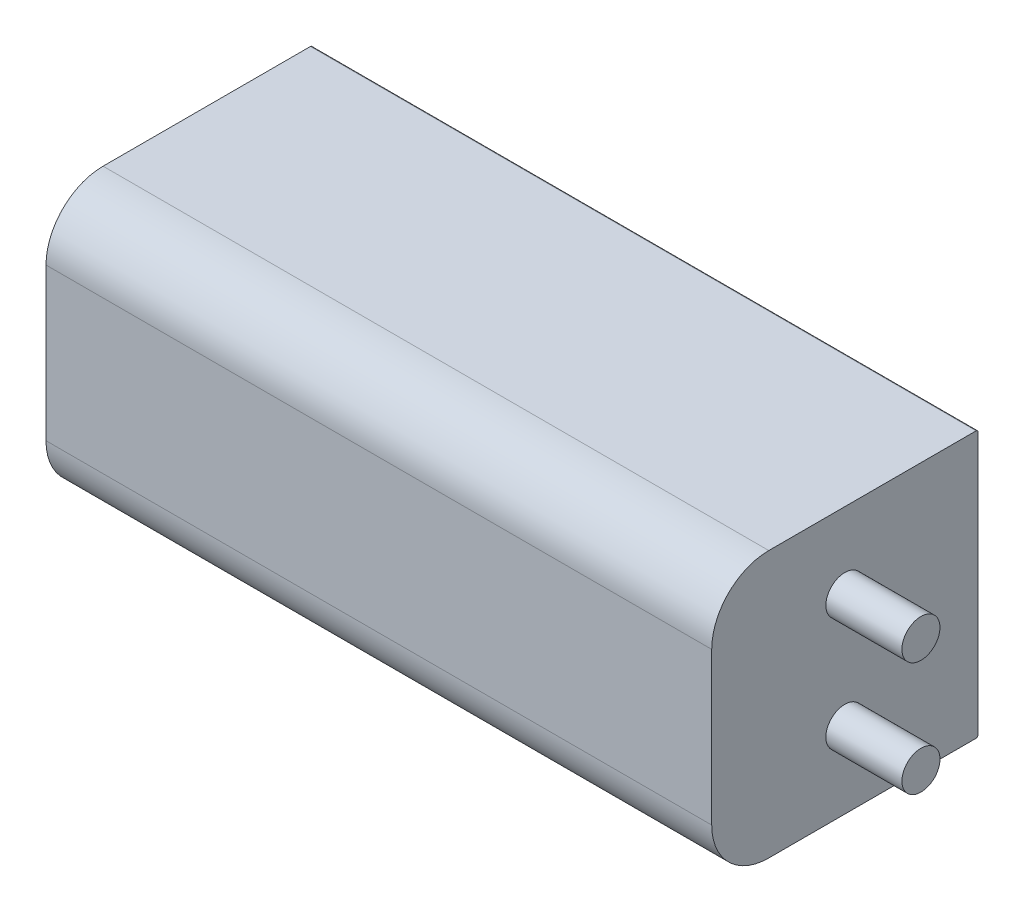
ISO-10303-21;
HEADER;
FILE_DESCRIPTION(('STEP AP214'),'2;1');
FILE_NAME('part.step','',(''),(''),'','','');
FILE_SCHEMA(('AUTOMOTIVE_DESIGN { 1 0 10303 214 1 1 1 1 }'));
ENDSEC;
DATA;
#1=APPLICATION_CONTEXT('core data for automotive mechanical design processes');
#2=APPLICATION_PROTOCOL_DEFINITION('international standard','automotive_design',2000,#1);
#3=PRODUCT_CONTEXT('',#1,'mechanical');
#4=PRODUCT('Part','Part','',(#3));
#5=PRODUCT_RELATED_PRODUCT_CATEGORY('part','',(#4));
#6=PRODUCT_DEFINITION_FORMATION('','',#4);
#7=PRODUCT_DEFINITION_CONTEXT('part definition',#1,'design');
#8=PRODUCT_DEFINITION('design','',#6,#7);
#9=PRODUCT_DEFINITION_SHAPE('','',#8);
#10=(LENGTH_UNIT() NAMED_UNIT(*) SI_UNIT(.MILLI.,.METRE.));
#11=(NAMED_UNIT(*) PLANE_ANGLE_UNIT() SI_UNIT($,.RADIAN.));
#12=(NAMED_UNIT(*) SI_UNIT($,.STERADIAN.) SOLID_ANGLE_UNIT());
#13=UNCERTAINTY_MEASURE_WITH_UNIT(LENGTH_MEASURE(1.E-05),#10,'distance_accuracy_value','');
#14=(GEOMETRIC_REPRESENTATION_CONTEXT(3) GLOBAL_UNCERTAINTY_ASSIGNED_CONTEXT((#13)) GLOBAL_UNIT_ASSIGNED_CONTEXT((#10,
#11,#12)) REPRESENTATION_CONTEXT('',''));
#15=CARTESIAN_POINT('',(0.,0.,0.));
#16=DIRECTION('',(0.,0.,1.));
#17=DIRECTION('',(1.,0.,0.));
#18=AXIS2_PLACEMENT_3D('',#15,#16,#17);
#19=CARTESIAN_POINT('',(0.,140.,0.));
#20=DIRECTION('',(0.,0.,-1.));
#21=DIRECTION('',(-1.,0.,0.));
#22=AXIS2_PLACEMENT_3D('',#19,#20,#21);
#23=PLANE('',#22);
#24=DIRECTION('',(0.,-1.,0.));
#25=VECTOR('',#24,1.);
#26=CARTESIAN_POINT('',(0.,140.,0.));
#27=LINE('',#26,#25);
#28=CARTESIAN_POINT('',(0.,139.,0.));
#29=VERTEX_POINT('',#28);
#30=CARTESIAN_POINT('',(0.,1.,0.));
#31=VERTEX_POINT('',#30);
#32=EDGE_CURVE('E124',#29,#31,#27,.T.);
#33=ORIENTED_EDGE('',*,*,#32,.F.);
#34=DIRECTION('',(1.,0.,0.));
#35=VECTOR('',#34,1.);
#36=CARTESIAN_POINT('',(0.,139.,0.));
#37=LINE('',#36,#35);
#38=CARTESIAN_POINT('',(350.,139.,0.));
#39=VERTEX_POINT('',#38);
#40=EDGE_CURVE('E142',#29,#39,#37,.T.);
#41=ORIENTED_EDGE('',*,*,#40,.T.);
#42=DIRECTION('',(0.,-1.,0.));
#43=VECTOR('',#42,1.);
#44=CARTESIAN_POINT('',(350.,140.,0.));
#45=LINE('',#44,#43);
#46=CARTESIAN_POINT('',(350.,1.,0.));
#47=VERTEX_POINT('',#46);
#48=EDGE_CURVE('E160',#39,#47,#45,.T.);
#49=ORIENTED_EDGE('',*,*,#48,.T.);
#50=DIRECTION('',(1.,0.,0.));
#51=VECTOR('',#50,1.);
#52=CARTESIAN_POINT('',(0.,1.,0.));
#53=LINE('',#52,#51);
#54=EDGE_CURVE('E140',#47,#31,#53,.F.);
#55=ORIENTED_EDGE('',*,*,#54,.T.);
#56=EDGE_LOOP('',(#33,#41,#49,#55));
#57=FACE_BOUND('',#56,.T.);
#58=ADVANCED_FACE('F35',(#57),#23,.T.);
#59=CARTESIAN_POINT('',(0.,140.,0.));
#60=DIRECTION('',(1.,0.,0.));
#61=DIRECTION('',(0.,0.,-1.));
#62=AXIS2_PLACEMENT_3D('',#59,#60,#61);
#63=PLANE('',#62);
#64=CARTESIAN_POINT('',(0.,40.,70.));
#65=DIRECTION('',(1.,0.,0.));
#66=DIRECTION('',(0.,0.,-1.));
#67=AXIS2_PLACEMENT_3D('',#64,#65,#66);
#68=CIRCLE('',#67,10.5);
#69=CARTESIAN_POINT('',(0.,40.,59.5));
#70=VERTEX_POINT('',#69);
#71=EDGE_CURVE('E361',#70,#70,#68,.T.);
#72=ORIENTED_EDGE('',*,*,#71,.T.);
#73=EDGE_LOOP('',(#72));
#74=FACE_BOUND('',#73,.T.);
#75=CARTESIAN_POINT('',(0.,100.,70.));
#76=DIRECTION('',(1.,0.,0.));
#77=DIRECTION('',(0.,0.,-1.));
#78=AXIS2_PLACEMENT_3D('',#75,#76,#77);
#79=CIRCLE('',#78,10.5);
#80=CARTESIAN_POINT('',(0.,100.,59.5));
#81=VERTEX_POINT('',#80);
#82=EDGE_CURVE('E356',#81,#81,#79,.T.);
#83=ORIENTED_EDGE('',*,*,#82,.T.);
#84=EDGE_LOOP('',(#83));
#85=FACE_BOUND('',#84,.T.);
#86=DIRECTION('',(0.,0.,1.));
#87=VECTOR('',#86,1.);
#88=CARTESIAN_POINT('',(0.,140.,0.));
#89=LINE('',#88,#87);
#90=CARTESIAN_POINT('',(0.,140.,1.));
#91=VERTEX_POINT('',#90);
#92=CARTESIAN_POINT('',(0.,140.,110.));
#93=VERTEX_POINT('',#92);
#94=EDGE_CURVE('E100',#91,#93,#89,.T.);
#95=ORIENTED_EDGE('',*,*,#94,.F.);
#96=CARTESIAN_POINT('',(0.,139.,1.));
#97=DIRECTION('',(1.,0.,0.));
#98=DIRECTION('',(0.,0.,-1.));
#99=AXIS2_PLACEMENT_3D('',#96,#97,#98);
#100=CIRCLE('',#99,1.);
#101=EDGE_CURVE('E43',#91,#29,#100,.F.);
#102=ORIENTED_EDGE('',*,*,#101,.T.);
#103=ORIENTED_EDGE('',*,*,#32,.T.);
#104=CARTESIAN_POINT('',(0.,1.,1.));
#105=DIRECTION('',(1.,0.,0.));
#106=DIRECTION('',(0.,0.,-1.));
#107=AXIS2_PLACEMENT_3D('',#104,#105,#106);
#108=CIRCLE('',#107,1.);
#109=CARTESIAN_POINT('',(0.,0.,1.));
#110=VERTEX_POINT('',#109);
#111=EDGE_CURVE('E50',#31,#110,#108,.F.);
#112=ORIENTED_EDGE('',*,*,#111,.T.);
#113=DIRECTION('',(0.,0.,1.));
#114=VECTOR('',#113,1.);
#115=CARTESIAN_POINT('',(0.,0.,0.));
#116=LINE('',#115,#114);
#117=CARTESIAN_POINT('',(0.,0.,110.));
#118=VERTEX_POINT('',#117);
#119=EDGE_CURVE('E166',#110,#118,#116,.T.);
#120=ORIENTED_EDGE('',*,*,#119,.T.);
#121=CARTESIAN_POINT('',(0.,30.,110.));
#122=DIRECTION('',(1.,0.,0.));
#123=DIRECTION('',(0.,0.,-1.));
#124=AXIS2_PLACEMENT_3D('',#121,#122,#123);
#125=CIRCLE('',#124,30.);
#126=CARTESIAN_POINT('',(0.,30.,140.));
#127=VERTEX_POINT('',#126);
#128=EDGE_CURVE('E118',#118,#127,#125,.F.);
#129=ORIENTED_EDGE('',*,*,#128,.T.);
#130=DIRECTION('',(0.,-1.,0.));
#131=VECTOR('',#130,1.);
#132=CARTESIAN_POINT('',(0.,140.,140.));
#133=LINE('',#132,#131);
#134=CARTESIAN_POINT('',(0.,110.,140.));
#135=VERTEX_POINT('',#134);
#136=EDGE_CURVE('E114',#135,#127,#133,.T.);
#137=ORIENTED_EDGE('',*,*,#136,.F.);
#138=CARTESIAN_POINT('',(0.,110.,110.));
#139=DIRECTION('',(1.,0.,0.));
#140=DIRECTION('',(0.,0.,-1.));
#141=AXIS2_PLACEMENT_3D('',#138,#139,#140);
#142=CIRCLE('',#141,30.);
#143=EDGE_CURVE('E111',#135,#93,#142,.F.);
#144=ORIENTED_EDGE('',*,*,#143,.T.);
#145=EDGE_LOOP('',(#95,#102,#103,#112,#120,#129,#137,#144));
#146=FACE_BOUND('',#145,.T.);
#147=ADVANCED_FACE('F112',(#74,#85,#146),#63,.F.);
#148=CARTESIAN_POINT('',(0.,140.,140.));
#149=DIRECTION('',(0.,0.,-1.));
#150=DIRECTION('',(-1.,0.,0.));
#151=AXIS2_PLACEMENT_3D('',#148,#149,#150);
#152=PLANE('',#151);
#153=DIRECTION('',(0.,-1.,0.));
#154=VECTOR('',#153,1.);
#155=CARTESIAN_POINT('',(350.,140.,140.));
#156=LINE('',#155,#154);
#157=CARTESIAN_POINT('',(350.,110.,140.));
#158=VERTEX_POINT('',#157);
#159=CARTESIAN_POINT('',(350.,30.,140.));
#160=VERTEX_POINT('',#159);
#161=EDGE_CURVE('E162',#158,#160,#156,.T.);
#162=ORIENTED_EDGE('',*,*,#161,.F.);
#163=DIRECTION('',(1.,0.,0.));
#164=VECTOR('',#163,1.);
#165=CARTESIAN_POINT('',(0.,110.,140.));
#166=LINE('',#165,#164);
#167=EDGE_CURVE('E135',#158,#135,#166,.F.);
#168=ORIENTED_EDGE('',*,*,#167,.T.);
#169=ORIENTED_EDGE('',*,*,#136,.T.);
#170=DIRECTION('',(1.,0.,0.));
#171=VECTOR('',#170,1.);
#172=CARTESIAN_POINT('',(0.,30.,140.));
#173=LINE('',#172,#171);
#174=EDGE_CURVE('E132',#127,#160,#173,.T.);
#175=ORIENTED_EDGE('',*,*,#174,.T.);
#176=EDGE_LOOP('',(#162,#168,#169,#175));
#177=FACE_BOUND('',#176,.T.);
#178=ADVANCED_FACE('F174',(#177),#152,.F.);
#179=CARTESIAN_POINT('',(350.,140.,0.));
#180=DIRECTION('',(1.,0.,0.));
#181=DIRECTION('',(0.,0.,-1.));
#182=AXIS2_PLACEMENT_3D('',#179,#180,#181);
#183=PLANE('',#182);
#184=CARTESIAN_POINT('',(350.,40.,70.));
#185=DIRECTION('',(1.,0.,0.));
#186=DIRECTION('',(0.,0.,-1.));
#187=AXIS2_PLACEMENT_3D('',#184,#185,#186);
#188=CIRCLE('',#187,10.);
#189=CARTESIAN_POINT('',(350.,40.,60.));
#190=VERTEX_POINT('',#189);
#191=EDGE_CURVE('E373',#190,#190,#188,.T.);
#192=ORIENTED_EDGE('',*,*,#191,.F.);
#193=EDGE_LOOP('',(#192));
#194=FACE_BOUND('',#193,.T.);
#195=CARTESIAN_POINT('',(350.,100.,70.));
#196=DIRECTION('',(1.,0.,0.));
#197=DIRECTION('',(0.,0.,-1.));
#198=AXIS2_PLACEMENT_3D('',#195,#196,#197);
#199=CIRCLE('',#198,10.);
#200=CARTESIAN_POINT('',(350.,100.,60.));
#201=VERTEX_POINT('',#200);
#202=EDGE_CURVE('E367',#201,#201,#199,.T.);
#203=ORIENTED_EDGE('',*,*,#202,.F.);
#204=EDGE_LOOP('',(#203));
#205=FACE_BOUND('',#204,.T.);
#206=ORIENTED_EDGE('',*,*,#48,.F.);
#207=CARTESIAN_POINT('',(350.,139.,1.));
#208=DIRECTION('',(1.,0.,0.));
#209=DIRECTION('',(0.,0.,-1.));
#210=AXIS2_PLACEMENT_3D('',#207,#208,#209);
#211=CIRCLE('',#210,1.);
#212=CARTESIAN_POINT('',(350.,140.,1.));
#213=VERTEX_POINT('',#212);
#214=EDGE_CURVE('E147',#39,#213,#211,.T.);
#215=ORIENTED_EDGE('',*,*,#214,.T.);
#216=DIRECTION('',(0.,0.,1.));
#217=VECTOR('',#216,1.);
#218=CARTESIAN_POINT('',(350.,140.,0.));
#219=LINE('',#218,#217);
#220=CARTESIAN_POINT('',(350.,140.,110.));
#221=VERTEX_POINT('',#220);
#222=EDGE_CURVE('E106',#213,#221,#219,.T.);
#223=ORIENTED_EDGE('',*,*,#222,.T.);
#224=CARTESIAN_POINT('',(350.,110.,110.));
#225=DIRECTION('',(1.,0.,0.));
#226=DIRECTION('',(0.,0.,-1.));
#227=AXIS2_PLACEMENT_3D('',#224,#225,#226);
#228=CIRCLE('',#227,30.);
#229=EDGE_CURVE('E122',#221,#158,#228,.T.);
#230=ORIENTED_EDGE('',*,*,#229,.T.);
#231=ORIENTED_EDGE('',*,*,#161,.T.);
#232=CARTESIAN_POINT('',(350.,30.,110.));
#233=DIRECTION('',(1.,0.,0.));
#234=DIRECTION('',(0.,0.,-1.));
#235=AXIS2_PLACEMENT_3D('',#232,#233,#234);
#236=CIRCLE('',#235,30.);
#237=CARTESIAN_POINT('',(350.,0.,110.));
#238=VERTEX_POINT('',#237);
#239=EDGE_CURVE('E123',#160,#238,#236,.T.);
#240=ORIENTED_EDGE('',*,*,#239,.T.);
#241=DIRECTION('',(0.,0.,1.));
#242=VECTOR('',#241,1.);
#243=CARTESIAN_POINT('',(350.,0.,0.));
#244=LINE('',#243,#242);
#245=CARTESIAN_POINT('',(350.,0.,1.));
#246=VERTEX_POINT('',#245);
#247=EDGE_CURVE('E107',#246,#238,#244,.T.);
#248=ORIENTED_EDGE('',*,*,#247,.F.);
#249=CARTESIAN_POINT('',(350.,1.,1.));
#250=DIRECTION('',(1.,0.,0.));
#251=DIRECTION('',(0.,0.,-1.));
#252=AXIS2_PLACEMENT_3D('',#249,#250,#251);
#253=CIRCLE('',#252,1.);
#254=EDGE_CURVE('E145',#246,#47,#253,.T.);
#255=ORIENTED_EDGE('',*,*,#254,.T.);
#256=EDGE_LOOP('',(#206,#215,#223,#230,#231,#240,#248,#255));
#257=FACE_BOUND('',#256,.T.);
#258=ADVANCED_FACE('F159',(#194,#205,#257),#183,.T.);
#259=CARTESIAN_POINT('',(0.,140.,0.));
#260=DIRECTION('',(0.,1.,0.));
#261=DIRECTION('',(0.,0.,1.));
#262=AXIS2_PLACEMENT_3D('',#259,#260,#261);
#263=PLANE('',#262);
#264=ORIENTED_EDGE('',*,*,#222,.F.);
#265=DIRECTION('',(1.,0.,0.));
#266=VECTOR('',#265,1.);
#267=CARTESIAN_POINT('',(0.,140.,1.));
#268=LINE('',#267,#266);
#269=EDGE_CURVE('E58',#213,#91,#268,.F.);
#270=ORIENTED_EDGE('',*,*,#269,.T.);
#271=ORIENTED_EDGE('',*,*,#94,.T.);
#272=DIRECTION('',(1.,0.,0.));
#273=VECTOR('',#272,1.);
#274=CARTESIAN_POINT('',(350.,140.,110.));
#275=LINE('',#274,#273);
#276=EDGE_CURVE('E104',#93,#221,#275,.T.);
#277=ORIENTED_EDGE('',*,*,#276,.T.);
#278=EDGE_LOOP('',(#264,#270,#271,#277));
#279=FACE_BOUND('',#278,.T.);
#280=ADVANCED_FACE('F102',(#279),#263,.T.);
#281=CARTESIAN_POINT('',(0.,0.,0.));
#282=DIRECTION('',(0.,1.,0.));
#283=DIRECTION('',(0.,0.,1.));
#284=AXIS2_PLACEMENT_3D('',#281,#282,#283);
#285=PLANE('',#284);
#286=ORIENTED_EDGE('',*,*,#119,.F.);
#287=DIRECTION('',(1.,0.,0.));
#288=VECTOR('',#287,1.);
#289=CARTESIAN_POINT('',(350.,0.,1.));
#290=LINE('',#289,#288);
#291=EDGE_CURVE('E11',#110,#246,#290,.T.);
#292=ORIENTED_EDGE('',*,*,#291,.T.);
#293=ORIENTED_EDGE('',*,*,#247,.T.);
#294=DIRECTION('',(1.,0.,0.));
#295=VECTOR('',#294,1.);
#296=CARTESIAN_POINT('',(0.,0.,110.));
#297=LINE('',#296,#295);
#298=EDGE_CURVE('E117',#238,#118,#297,.F.);
#299=ORIENTED_EDGE('',*,*,#298,.T.);
#300=EDGE_LOOP('',(#286,#292,#293,#299));
#301=FACE_BOUND('',#300,.T.);
#302=ADVANCED_FACE('F181',(#301),#285,.F.);
#303=CARTESIAN_POINT('',(41.,100.,70.));
#304=DIRECTION('',(-1.,0.,0.));
#305=DIRECTION('',(0.,0.,1.));
#306=AXIS2_PLACEMENT_3D('',#303,#304,#305);
#307=CYLINDRICAL_SURFACE('',#306,10.5);
#308=CARTESIAN_POINT('',(41.,100.,70.));
#309=DIRECTION('',(1.,0.,0.));
#310=DIRECTION('',(0.,0.,-1.));
#311=AXIS2_PLACEMENT_3D('',#308,#309,#310);
#312=CIRCLE('',#311,10.5);
#313=CARTESIAN_POINT('',(41.,100.,59.5));
#314=VERTEX_POINT('',#313);
#315=EDGE_CURVE('E168',#314,#314,#312,.T.);
#316=ORIENTED_EDGE('',*,*,#315,.T.);
#317=EDGE_LOOP('',(#316));
#318=FACE_BOUND('',#317,.T.);
#319=ORIENTED_EDGE('',*,*,#82,.F.);
#320=EDGE_LOOP('',(#319));
#321=FACE_BOUND('',#320,.T.);
#322=ADVANCED_FACE('F287',(#318,#321),#307,.F.);
#323=CARTESIAN_POINT('',(41.,100.,70.));
#324=DIRECTION('',(1.,0.,0.));
#325=DIRECTION('',(0.,0.,-1.));
#326=AXIS2_PLACEMENT_3D('',#323,#324,#325);
#327=PLANE('',#326);
#328=ORIENTED_EDGE('',*,*,#315,.F.);
#329=EDGE_LOOP('',(#328));
#330=FACE_BOUND('',#329,.T.);
#331=ADVANCED_FACE('F283',(#330),#327,.F.);
#332=CARTESIAN_POINT('',(41.,40.,70.));
#333=DIRECTION('',(-1.,0.,0.));
#334=DIRECTION('',(0.,0.,1.));
#335=AXIS2_PLACEMENT_3D('',#332,#333,#334);
#336=CYLINDRICAL_SURFACE('',#335,10.5);
#337=CARTESIAN_POINT('',(41.,40.,70.));
#338=DIRECTION('',(1.,0.,0.));
#339=DIRECTION('',(0.,0.,-1.));
#340=AXIS2_PLACEMENT_3D('',#337,#338,#339);
#341=CIRCLE('',#340,10.5);
#342=CARTESIAN_POINT('',(41.,40.,59.5));
#343=VERTEX_POINT('',#342);
#344=EDGE_CURVE('E358',#343,#343,#341,.T.);
#345=ORIENTED_EDGE('',*,*,#344,.T.);
#346=EDGE_LOOP('',(#345));
#347=FACE_BOUND('',#346,.T.);
#348=ORIENTED_EDGE('',*,*,#71,.F.);
#349=EDGE_LOOP('',(#348));
#350=FACE_BOUND('',#349,.T.);
#351=ADVANCED_FACE('F279',(#347,#350),#336,.F.);
#352=CARTESIAN_POINT('',(41.,40.,70.));
#353=DIRECTION('',(1.,0.,0.));
#354=DIRECTION('',(0.,0.,-1.));
#355=AXIS2_PLACEMENT_3D('',#352,#353,#354);
#356=PLANE('',#355);
#357=ORIENTED_EDGE('',*,*,#344,.F.);
#358=EDGE_LOOP('',(#357));
#359=FACE_BOUND('',#358,.T.);
#360=ADVANCED_FACE('F204',(#359),#356,.F.);
#361=CARTESIAN_POINT('',(0.,110.,110.));
#362=DIRECTION('',(-1.,0.,0.));
#363=DIRECTION('',(0.,0.,1.));
#364=AXIS2_PLACEMENT_3D('',#361,#362,#363);
#365=CYLINDRICAL_SURFACE('',#364,30.);
#366=ORIENTED_EDGE('',*,*,#143,.F.);
#367=ORIENTED_EDGE('',*,*,#167,.F.);
#368=ORIENTED_EDGE('',*,*,#229,.F.);
#369=ORIENTED_EDGE('',*,*,#276,.F.);
#370=EDGE_LOOP('',(#366,#367,#368,#369));
#371=FACE_BOUND('',#370,.T.);
#372=ADVANCED_FACE('F121',(#371),#365,.T.);
#373=CARTESIAN_POINT('',(0.,30.,110.));
#374=DIRECTION('',(1.,0.,0.));
#375=DIRECTION('',(0.,0.,-1.));
#376=AXIS2_PLACEMENT_3D('',#373,#374,#375);
#377=CYLINDRICAL_SURFACE('',#376,30.);
#378=ORIENTED_EDGE('',*,*,#128,.F.);
#379=ORIENTED_EDGE('',*,*,#298,.F.);
#380=ORIENTED_EDGE('',*,*,#239,.F.);
#381=ORIENTED_EDGE('',*,*,#174,.F.);
#382=EDGE_LOOP('',(#378,#379,#380,#381));
#383=FACE_BOUND('',#382,.T.);
#384=ADVANCED_FACE('F177',(#383),#377,.T.);
#385=CARTESIAN_POINT('',(0.,139.,1.));
#386=DIRECTION('',(1.,0.,0.));
#387=DIRECTION('',(0.,0.,-1.));
#388=AXIS2_PLACEMENT_3D('',#385,#386,#387);
#389=CYLINDRICAL_SURFACE('',#388,1.);
#390=ORIENTED_EDGE('',*,*,#101,.F.);
#391=ORIENTED_EDGE('',*,*,#269,.F.);
#392=ORIENTED_EDGE('',*,*,#214,.F.);
#393=ORIENTED_EDGE('',*,*,#40,.F.);
#394=EDGE_LOOP('',(#390,#391,#392,#393));
#395=FACE_BOUND('',#394,.T.);
#396=ADVANCED_FACE('F157',(#395),#389,.T.);
#397=CARTESIAN_POINT('',(0.,1.,1.));
#398=DIRECTION('',(-1.,0.,0.));
#399=DIRECTION('',(0.,0.,1.));
#400=AXIS2_PLACEMENT_3D('',#397,#398,#399);
#401=CYLINDRICAL_SURFACE('',#400,1.);
#402=ORIENTED_EDGE('',*,*,#111,.F.);
#403=ORIENTED_EDGE('',*,*,#54,.F.);
#404=ORIENTED_EDGE('',*,*,#254,.F.);
#405=ORIENTED_EDGE('',*,*,#291,.F.);
#406=EDGE_LOOP('',(#402,#403,#404,#405));
#407=FACE_BOUND('',#406,.T.);
#408=ADVANCED_FACE('F37',(#407),#401,.T.);
#409=CARTESIAN_POINT('',(390.,100.,70.));
#410=DIRECTION('',(-1.,0.,0.));
#411=DIRECTION('',(0.,0.,1.));
#412=AXIS2_PLACEMENT_3D('',#409,#410,#411);
#413=CYLINDRICAL_SURFACE('',#412,10.);
#414=CARTESIAN_POINT('',(390.,100.,70.));
#415=DIRECTION('',(1.,0.,0.));
#416=DIRECTION('',(0.,0.,-1.));
#417=AXIS2_PLACEMENT_3D('',#414,#415,#416);
#418=CIRCLE('',#417,10.);
#419=CARTESIAN_POINT('',(390.,100.,60.));
#420=VERTEX_POINT('',#419);
#421=EDGE_CURVE('E365',#420,#420,#418,.T.);
#422=ORIENTED_EDGE('',*,*,#421,.F.);
#423=EDGE_LOOP('',(#422));
#424=FACE_BOUND('',#423,.T.);
#425=ORIENTED_EDGE('',*,*,#202,.T.);
#426=EDGE_LOOP('',(#425));
#427=FACE_BOUND('',#426,.T.);
#428=ADVANCED_FACE('F185',(#424,#427),#413,.T.);
#429=CARTESIAN_POINT('',(390.,100.,70.));
#430=DIRECTION('',(1.,0.,0.));
#431=DIRECTION('',(0.,0.,-1.));
#432=AXIS2_PLACEMENT_3D('',#429,#430,#431);
#433=PLANE('',#432);
#434=ORIENTED_EDGE('',*,*,#421,.T.);
#435=EDGE_LOOP('',(#434));
#436=FACE_BOUND('',#435,.T.);
#437=ADVANCED_FACE('F190',(#436),#433,.T.);
#438=CARTESIAN_POINT('',(390.,40.,70.));
#439=DIRECTION('',(-1.,0.,0.));
#440=DIRECTION('',(0.,0.,1.));
#441=AXIS2_PLACEMENT_3D('',#438,#439,#440);
#442=CYLINDRICAL_SURFACE('',#441,10.);
#443=CARTESIAN_POINT('',(390.,40.,70.));
#444=DIRECTION('',(1.,0.,0.));
#445=DIRECTION('',(0.,0.,-1.));
#446=AXIS2_PLACEMENT_3D('',#443,#444,#445);
#447=CIRCLE('',#446,10.);
#448=CARTESIAN_POINT('',(390.,40.,60.));
#449=VERTEX_POINT('',#448);
#450=EDGE_CURVE('E370',#449,#449,#447,.T.);
#451=ORIENTED_EDGE('',*,*,#450,.F.);
#452=EDGE_LOOP('',(#451));
#453=FACE_BOUND('',#452,.T.);
#454=ORIENTED_EDGE('',*,*,#191,.T.);
#455=EDGE_LOOP('',(#454));
#456=FACE_BOUND('',#455,.T.);
#457=ADVANCED_FACE('F252',(#453,#456),#442,.T.);
#458=CARTESIAN_POINT('',(390.,40.,70.));
#459=DIRECTION('',(1.,0.,0.));
#460=DIRECTION('',(0.,0.,-1.));
#461=AXIS2_PLACEMENT_3D('',#458,#459,#460);
#462=PLANE('',#461);
#463=ORIENTED_EDGE('',*,*,#450,.T.);
#464=EDGE_LOOP('',(#463));
#465=FACE_BOUND('',#464,.T.);
#466=ADVANCED_FACE('F262',(#465),#462,.T.);
#467=CLOSED_SHELL('',(#58,#147,#178,#258,#280,#302,#322,#331,#351,#360,#372,#384,#396,#408,#428,
#437,#457,#466));
#468=MANIFOLD_SOLID_BREP('B2',#467);
#469=ADVANCED_BREP_SHAPE_REPRESENTATION('',(#18,#468),#14);
#470=SHAPE_DEFINITION_REPRESENTATION(#9,#469);
ENDSEC;
END-ISO-10303-21;
